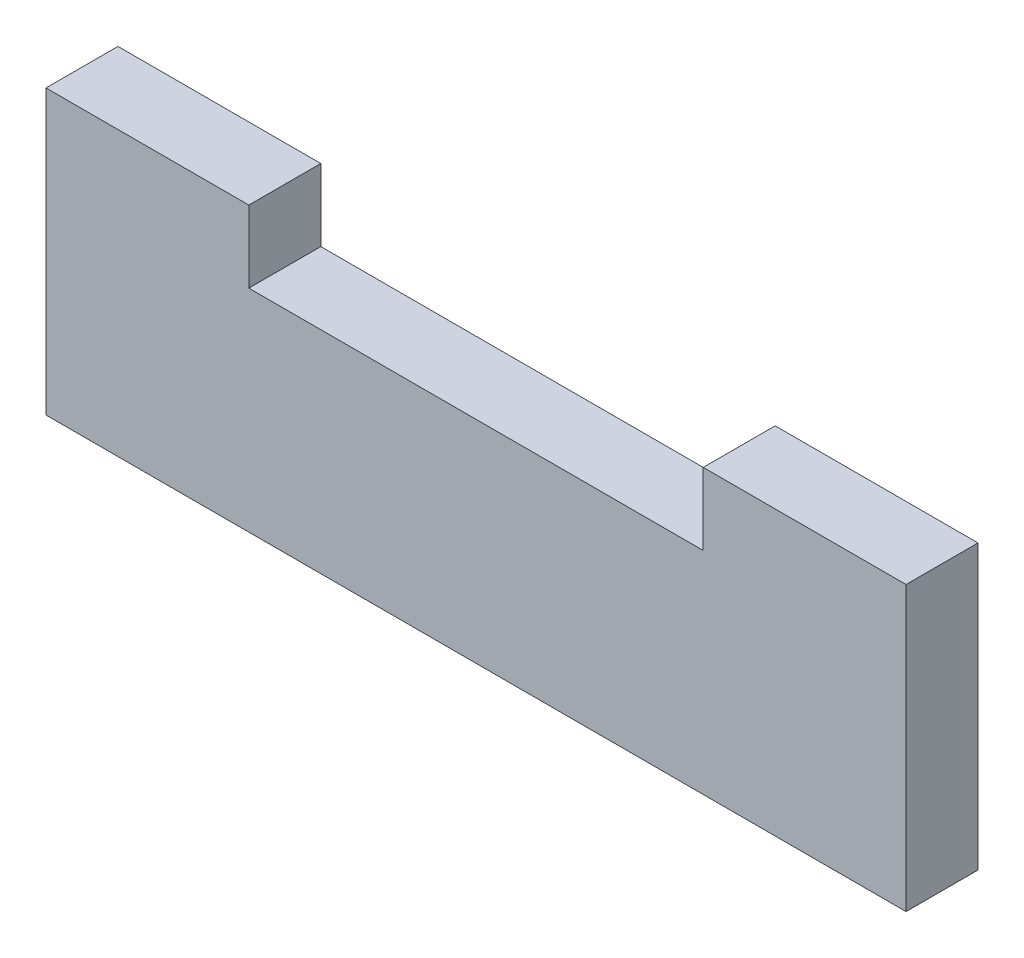
ISO-10303-21;
HEADER;
FILE_DESCRIPTION(('STEP AP214'),'2;1');
FILE_NAME('part.step','',(''),(''),'','','');
FILE_SCHEMA(('AUTOMOTIVE_DESIGN { 1 0 10303 214 1 1 1 1 }'));
ENDSEC;
DATA;
#1=APPLICATION_CONTEXT('core data for automotive mechanical design processes');
#2=APPLICATION_PROTOCOL_DEFINITION('international standard','automotive_design',2000,#1);
#3=PRODUCT_CONTEXT('',#1,'mechanical');
#4=PRODUCT('Part','Part','',(#3));
#5=PRODUCT_RELATED_PRODUCT_CATEGORY('part','',(#4));
#6=PRODUCT_DEFINITION_FORMATION('','',#4);
#7=PRODUCT_DEFINITION_CONTEXT('part definition',#1,'design');
#8=PRODUCT_DEFINITION('design','',#6,#7);
#9=PRODUCT_DEFINITION_SHAPE('','',#8);
#10=(LENGTH_UNIT() NAMED_UNIT(*) SI_UNIT(.MILLI.,.METRE.));
#11=(NAMED_UNIT(*) PLANE_ANGLE_UNIT() SI_UNIT($,.RADIAN.));
#12=(NAMED_UNIT(*) SI_UNIT($,.STERADIAN.) SOLID_ANGLE_UNIT());
#13=UNCERTAINTY_MEASURE_WITH_UNIT(LENGTH_MEASURE(1.E-05),#10,'distance_accuracy_value','');
#14=(GEOMETRIC_REPRESENTATION_CONTEXT(3) GLOBAL_UNCERTAINTY_ASSIGNED_CONTEXT((#13)) GLOBAL_UNIT_ASSIGNED_CONTEXT((#10,
#11,#12)) REPRESENTATION_CONTEXT('',''));
#15=CARTESIAN_POINT('',(0.,0.,0.));
#16=DIRECTION('',(0.,0.,1.));
#17=DIRECTION('',(1.,0.,0.));
#18=AXIS2_PLACEMENT_3D('',#15,#16,#17);
#19=CARTESIAN_POINT('',(-37.95,25.,6.35));
#20=DIRECTION('',(1.,0.,0.));
#21=DIRECTION('',(0.,0.,-1.));
#22=AXIS2_PLACEMENT_3D('',#19,#20,#21);
#23=PLANE('',#22);
#24=DIRECTION('',(0.,-1.,0.));
#25=VECTOR('',#24,1.);
#26=CARTESIAN_POINT('',(-37.95,25.,0.));
#27=LINE('',#26,#25);
#28=CARTESIAN_POINT('',(-37.95,25.,0.));
#29=VERTEX_POINT('',#28);
#30=CARTESIAN_POINT('',(-37.95,0.,0.));
#31=VERTEX_POINT('',#30);
#32=EDGE_CURVE('E140',#29,#31,#27,.T.);
#33=ORIENTED_EDGE('',*,*,#32,.T.);
#34=DIRECTION('',(0.,0.,-1.));
#35=VECTOR('',#34,1.);
#36=CARTESIAN_POINT('',(-37.95,0.,6.35));
#37=LINE('',#36,#35);
#38=CARTESIAN_POINT('',(-37.95,0.,6.35));
#39=VERTEX_POINT('',#38);
#40=EDGE_CURVE('E11',#39,#31,#37,.T.);
#41=ORIENTED_EDGE('',*,*,#40,.F.);
#42=DIRECTION('',(0.,-1.,0.));
#43=VECTOR('',#42,1.);
#44=CARTESIAN_POINT('',(-37.95,25.,6.35));
#45=LINE('',#44,#43);
#46=CARTESIAN_POINT('',(-37.95,25.,6.35));
#47=VERTEX_POINT('',#46);
#48=EDGE_CURVE('E162',#47,#39,#45,.T.);
#49=ORIENTED_EDGE('',*,*,#48,.F.);
#50=DIRECTION('',(0.,0.,-1.));
#51=VECTOR('',#50,1.);
#52=CARTESIAN_POINT('',(-37.95,25.,6.35));
#53=LINE('',#52,#51);
#54=EDGE_CURVE('E136',#47,#29,#53,.T.);
#55=ORIENTED_EDGE('',*,*,#54,.T.);
#56=EDGE_LOOP('',(#33,#41,#49,#55));
#57=FACE_BOUND('',#56,.T.);
#58=ADVANCED_FACE('F39',(#57),#23,.F.);
#59=CARTESIAN_POINT('',(-37.95,0.,6.35));
#60=DIRECTION('',(0.,1.,0.));
#61=DIRECTION('',(0.,0.,1.));
#62=AXIS2_PLACEMENT_3D('',#59,#60,#61);
#63=PLANE('',#62);
#64=DIRECTION('',(1.,0.,0.));
#65=VECTOR('',#64,1.);
#66=CARTESIAN_POINT('',(-37.95,0.,0.));
#67=LINE('',#66,#65);
#68=CARTESIAN_POINT('',(37.95,0.,0.));
#69=VERTEX_POINT('',#68);
#70=EDGE_CURVE('E144',#31,#69,#67,.T.);
#71=ORIENTED_EDGE('',*,*,#70,.T.);
#72=DIRECTION('',(0.,0.,-1.));
#73=VECTOR('',#72,1.);
#74=CARTESIAN_POINT('',(37.95,0.,6.35));
#75=LINE('',#74,#73);
#76=CARTESIAN_POINT('',(37.95,0.,6.35));
#77=VERTEX_POINT('',#76);
#78=EDGE_CURVE('E48',#77,#69,#75,.T.);
#79=ORIENTED_EDGE('',*,*,#78,.F.);
#80=DIRECTION('',(1.,0.,0.));
#81=VECTOR('',#80,1.);
#82=CARTESIAN_POINT('',(-37.95,0.,6.35));
#83=LINE('',#82,#81);
#84=EDGE_CURVE('E99',#39,#77,#83,.T.);
#85=ORIENTED_EDGE('',*,*,#84,.F.);
#86=ORIENTED_EDGE('',*,*,#40,.T.);
#87=EDGE_LOOP('',(#71,#79,#85,#86));
#88=FACE_BOUND('',#87,.T.);
#89=ADVANCED_FACE('F208',(#88),#63,.F.);
#90=CARTESIAN_POINT('',(37.95,0.,6.35));
#91=DIRECTION('',(-1.,0.,0.));
#92=DIRECTION('',(0.,0.,1.));
#93=AXIS2_PLACEMENT_3D('',#90,#91,#92);
#94=PLANE('',#93);
#95=DIRECTION('',(0.,1.,0.));
#96=VECTOR('',#95,1.);
#97=CARTESIAN_POINT('',(37.95,0.,0.));
#98=LINE('',#97,#96);
#99=CARTESIAN_POINT('',(37.95,25.,0.));
#100=VERTEX_POINT('',#99);
#101=EDGE_CURVE('E147',#69,#100,#98,.T.);
#102=ORIENTED_EDGE('',*,*,#101,.T.);
#103=DIRECTION('',(0.,0.,-1.));
#104=VECTOR('',#103,1.);
#105=CARTESIAN_POINT('',(37.95,25.,6.35));
#106=LINE('',#105,#104);
#107=CARTESIAN_POINT('',(37.95,25.,6.35));
#108=VERTEX_POINT('',#107);
#109=EDGE_CURVE('E173',#108,#100,#106,.T.);
#110=ORIENTED_EDGE('',*,*,#109,.F.);
#111=DIRECTION('',(0.,1.,0.));
#112=VECTOR('',#111,1.);
#113=CARTESIAN_POINT('',(37.95,0.,6.35));
#114=LINE('',#113,#112);
#115=EDGE_CURVE('E183',#77,#108,#114,.T.);
#116=ORIENTED_EDGE('',*,*,#115,.F.);
#117=ORIENTED_EDGE('',*,*,#78,.T.);
#118=EDGE_LOOP('',(#102,#110,#116,#117));
#119=FACE_BOUND('',#118,.T.);
#120=ADVANCED_FACE('F181',(#119),#94,.F.);
#121=CARTESIAN_POINT('',(37.95,25.,6.35));
#122=DIRECTION('',(0.,-1.,0.));
#123=DIRECTION('',(1.,0.,0.));
#124=AXIS2_PLACEMENT_3D('',#121,#122,#123);
#125=PLANE('',#124);
#126=DIRECTION('',(-1.,0.,0.));
#127=VECTOR('',#126,1.);
#128=CARTESIAN_POINT('',(37.95,25.,0.));
#129=LINE('',#128,#127);
#130=CARTESIAN_POINT('',(20.05,25.,0.));
#131=VERTEX_POINT('',#130);
#132=EDGE_CURVE('E150',#100,#131,#129,.T.);
#133=ORIENTED_EDGE('',*,*,#132,.T.);
#134=DIRECTION('',(0.,0.,-1.));
#135=VECTOR('',#134,1.);
#136=CARTESIAN_POINT('',(20.05,25.,6.35));
#137=LINE('',#136,#135);
#138=CARTESIAN_POINT('',(20.05,25.,6.35));
#139=VERTEX_POINT('',#138);
#140=EDGE_CURVE('E169',#139,#131,#137,.T.);
#141=ORIENTED_EDGE('',*,*,#140,.F.);
#142=DIRECTION('',(-1.,0.,0.));
#143=VECTOR('',#142,1.);
#144=CARTESIAN_POINT('',(37.95,25.,6.35));
#145=LINE('',#144,#143);
#146=EDGE_CURVE('E196',#108,#139,#145,.T.);
#147=ORIENTED_EDGE('',*,*,#146,.F.);
#148=ORIENTED_EDGE('',*,*,#109,.T.);
#149=EDGE_LOOP('',(#133,#141,#147,#148));
#150=FACE_BOUND('',#149,.T.);
#151=ADVANCED_FACE('F191',(#150),#125,.F.);
#152=CARTESIAN_POINT('',(20.05,25.,6.35));
#153=DIRECTION('',(1.,0.,0.));
#154=DIRECTION('',(0.,1.,0.));
#155=AXIS2_PLACEMENT_3D('',#152,#153,#154);
#156=PLANE('',#155);
#157=DIRECTION('',(0.,-1.,0.));
#158=VECTOR('',#157,1.);
#159=CARTESIAN_POINT('',(20.05,25.,0.));
#160=LINE('',#159,#158);
#161=CARTESIAN_POINT('',(20.05,18.65,0.));
#162=VERTEX_POINT('',#161);
#163=EDGE_CURVE('E153',#131,#162,#160,.T.);
#164=ORIENTED_EDGE('',*,*,#163,.T.);
#165=DIRECTION('',(0.,0.,-1.));
#166=VECTOR('',#165,1.);
#167=CARTESIAN_POINT('',(20.05,18.65,6.35));
#168=LINE('',#167,#166);
#169=CARTESIAN_POINT('',(20.05,18.65,6.35));
#170=VERTEX_POINT('',#169);
#171=EDGE_CURVE('E129',#170,#162,#168,.T.);
#172=ORIENTED_EDGE('',*,*,#171,.F.);
#173=DIRECTION('',(0.,-1.,0.));
#174=VECTOR('',#173,1.);
#175=CARTESIAN_POINT('',(20.05,25.,6.35));
#176=LINE('',#175,#174);
#177=EDGE_CURVE('E118',#139,#170,#176,.T.);
#178=ORIENTED_EDGE('',*,*,#177,.F.);
#179=ORIENTED_EDGE('',*,*,#140,.T.);
#180=EDGE_LOOP('',(#164,#172,#178,#179));
#181=FACE_BOUND('',#180,.T.);
#182=ADVANCED_FACE('F194',(#181),#156,.F.);
#183=CARTESIAN_POINT('',(20.05,18.65,6.35));
#184=DIRECTION('',(0.,-1.,0.));
#185=DIRECTION('',(1.,0.,0.));
#186=AXIS2_PLACEMENT_3D('',#183,#184,#185);
#187=PLANE('',#186);
#188=DIRECTION('',(-1.,0.,0.));
#189=VECTOR('',#188,1.);
#190=CARTESIAN_POINT('',(20.05,18.65,0.));
#191=LINE('',#190,#189);
#192=CARTESIAN_POINT('',(-20.05,18.65,0.));
#193=VERTEX_POINT('',#192);
#194=EDGE_CURVE('E127',#162,#193,#191,.T.);
#195=ORIENTED_EDGE('',*,*,#194,.T.);
#196=DIRECTION('',(0.,0.,-1.));
#197=VECTOR('',#196,1.);
#198=CARTESIAN_POINT('',(-20.05,18.65,6.35));
#199=LINE('',#198,#197);
#200=CARTESIAN_POINT('',(-20.05,18.65,6.35));
#201=VERTEX_POINT('',#200);
#202=EDGE_CURVE('E124',#201,#193,#199,.T.);
#203=ORIENTED_EDGE('',*,*,#202,.F.);
#204=DIRECTION('',(-1.,0.,0.));
#205=VECTOR('',#204,1.);
#206=CARTESIAN_POINT('',(20.05,18.65,6.35));
#207=LINE('',#206,#205);
#208=EDGE_CURVE('E112',#170,#201,#207,.T.);
#209=ORIENTED_EDGE('',*,*,#208,.F.);
#210=ORIENTED_EDGE('',*,*,#171,.T.);
#211=EDGE_LOOP('',(#195,#203,#209,#210));
#212=FACE_BOUND('',#211,.T.);
#213=ADVANCED_FACE('F125',(#212),#187,.F.);
#214=CARTESIAN_POINT('',(-20.05,18.65,6.35));
#215=DIRECTION('',(-1.,0.,0.));
#216=DIRECTION('',(0.,0.,1.));
#217=AXIS2_PLACEMENT_3D('',#214,#215,#216);
#218=PLANE('',#217);
#219=DIRECTION('',(0.,1.,0.));
#220=VECTOR('',#219,1.);
#221=CARTESIAN_POINT('',(-20.05,18.65,0.));
#222=LINE('',#221,#220);
#223=CARTESIAN_POINT('',(-20.05,25.,0.));
#224=VERTEX_POINT('',#223);
#225=EDGE_CURVE('E85',#193,#224,#222,.T.);
#226=ORIENTED_EDGE('',*,*,#225,.T.);
#227=DIRECTION('',(0.,0.,-1.));
#228=VECTOR('',#227,1.);
#229=CARTESIAN_POINT('',(-20.05,25.,6.35));
#230=LINE('',#229,#228);
#231=CARTESIAN_POINT('',(-20.05,25.,6.35));
#232=VERTEX_POINT('',#231);
#233=EDGE_CURVE('E130',#232,#224,#230,.T.);
#234=ORIENTED_EDGE('',*,*,#233,.F.);
#235=DIRECTION('',(0.,1.,0.));
#236=VECTOR('',#235,1.);
#237=CARTESIAN_POINT('',(-20.05,18.65,6.35));
#238=LINE('',#237,#236);
#239=EDGE_CURVE('E116',#201,#232,#238,.T.);
#240=ORIENTED_EDGE('',*,*,#239,.F.);
#241=ORIENTED_EDGE('',*,*,#202,.T.);
#242=EDGE_LOOP('',(#226,#234,#240,#241));
#243=FACE_BOUND('',#242,.T.);
#244=ADVANCED_FACE('F132',(#243),#218,.F.);
#245=CARTESIAN_POINT('',(-20.05,25.,6.35));
#246=DIRECTION('',(0.,-1.,0.));
#247=DIRECTION('',(1.,0.,0.));
#248=AXIS2_PLACEMENT_3D('',#245,#246,#247);
#249=PLANE('',#248);
#250=DIRECTION('',(-1.,0.,0.));
#251=VECTOR('',#250,1.);
#252=CARTESIAN_POINT('',(-20.05,25.,0.));
#253=LINE('',#252,#251);
#254=EDGE_CURVE('E91',#224,#29,#253,.T.);
#255=ORIENTED_EDGE('',*,*,#254,.T.);
#256=ORIENTED_EDGE('',*,*,#54,.F.);
#257=DIRECTION('',(-1.,0.,0.));
#258=VECTOR('',#257,1.);
#259=CARTESIAN_POINT('',(-20.05,25.,6.35));
#260=LINE('',#259,#258);
#261=EDGE_CURVE('E56',#232,#47,#260,.T.);
#262=ORIENTED_EDGE('',*,*,#261,.F.);
#263=ORIENTED_EDGE('',*,*,#233,.T.);
#264=EDGE_LOOP('',(#255,#256,#262,#263));
#265=FACE_BOUND('',#264,.T.);
#266=ADVANCED_FACE('F224',(#265),#249,.F.);
#267=CARTESIAN_POINT('',(0.,0.,6.35));
#268=DIRECTION('',(0.,0.,1.));
#269=DIRECTION('',(1.,0.,0.));
#270=AXIS2_PLACEMENT_3D('',#267,#268,#269);
#271=PLANE('',#270);
#272=ORIENTED_EDGE('',*,*,#48,.T.);
#273=ORIENTED_EDGE('',*,*,#84,.T.);
#274=ORIENTED_EDGE('',*,*,#115,.T.);
#275=ORIENTED_EDGE('',*,*,#146,.T.);
#276=ORIENTED_EDGE('',*,*,#177,.T.);
#277=ORIENTED_EDGE('',*,*,#208,.T.);
#278=ORIENTED_EDGE('',*,*,#239,.T.);
#279=ORIENTED_EDGE('',*,*,#261,.T.);
#280=EDGE_LOOP('',(#272,#273,#274,#275,#276,#277,#278,#279));
#281=FACE_BOUND('',#280,.T.);
#282=ADVANCED_FACE('F114',(#281),#271,.T.);
#283=CARTESIAN_POINT('',(0.,0.,0.));
#284=DIRECTION('',(0.,0.,1.));
#285=DIRECTION('',(1.,0.,0.));
#286=AXIS2_PLACEMENT_3D('',#283,#284,#285);
#287=PLANE('',#286);
#288=ORIENTED_EDGE('',*,*,#32,.F.);
#289=ORIENTED_EDGE('',*,*,#254,.F.);
#290=ORIENTED_EDGE('',*,*,#225,.F.);
#291=ORIENTED_EDGE('',*,*,#194,.F.);
#292=ORIENTED_EDGE('',*,*,#163,.F.);
#293=ORIENTED_EDGE('',*,*,#132,.F.);
#294=ORIENTED_EDGE('',*,*,#101,.F.);
#295=ORIENTED_EDGE('',*,*,#70,.F.);
#296=EDGE_LOOP('',(#288,#289,#290,#291,#292,#293,#294,#295));
#297=FACE_BOUND('',#296,.T.);
#298=ADVANCED_FACE('F187',(#297),#287,.F.);
#299=CLOSED_SHELL('',(#58,#89,#120,#151,#182,#213,#244,#266,#282,#298));
#300=MANIFOLD_SOLID_BREP('B2',#299);
#301=ADVANCED_BREP_SHAPE_REPRESENTATION('',(#18,#300),#14);
#302=SHAPE_DEFINITION_REPRESENTATION(#9,#301);
ENDSEC;
END-ISO-10303-21;
